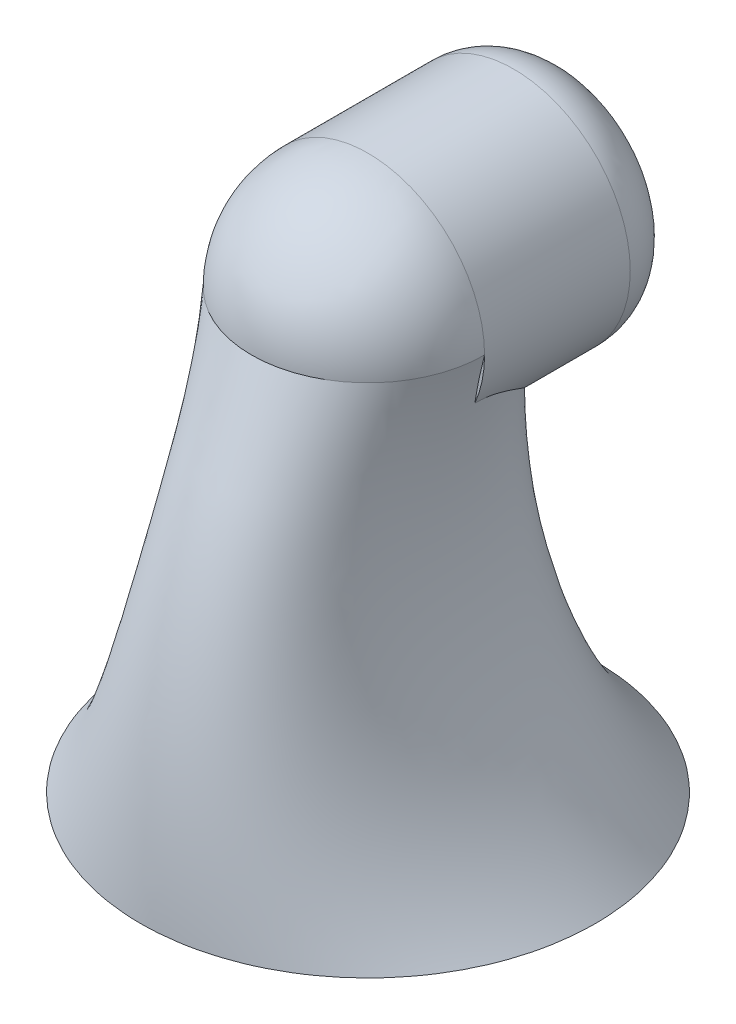
ISO-10303-21;
HEADER;
FILE_DESCRIPTION(('STEP AP214'),'2;1');
FILE_NAME('part.step','',(''),(''),'','','');
FILE_SCHEMA(('AUTOMOTIVE_DESIGN { 1 0 10303 214 1 1 1 1 }'));
ENDSEC;
DATA;
#1=APPLICATION_CONTEXT('core data for automotive mechanical design processes');
#2=APPLICATION_PROTOCOL_DEFINITION('international standard','automotive_design',2000,#1);
#3=PRODUCT_CONTEXT('',#1,'mechanical');
#4=PRODUCT('Part','Part','',(#3));
#5=PRODUCT_RELATED_PRODUCT_CATEGORY('part','',(#4));
#6=PRODUCT_DEFINITION_FORMATION('','',#4);
#7=PRODUCT_DEFINITION_CONTEXT('part definition',#1,'design');
#8=PRODUCT_DEFINITION('design','',#6,#7);
#9=PRODUCT_DEFINITION_SHAPE('','',#8);
#10=(LENGTH_UNIT() NAMED_UNIT(*) SI_UNIT(.MILLI.,.METRE.));
#11=(NAMED_UNIT(*) PLANE_ANGLE_UNIT() SI_UNIT($,.RADIAN.));
#12=(NAMED_UNIT(*) SI_UNIT($,.STERADIAN.) SOLID_ANGLE_UNIT());
#13=UNCERTAINTY_MEASURE_WITH_UNIT(LENGTH_MEASURE(1.E-05),#10,'distance_accuracy_value','');
#14=(GEOMETRIC_REPRESENTATION_CONTEXT(3) GLOBAL_UNCERTAINTY_ASSIGNED_CONTEXT((#13)) GLOBAL_UNIT_ASSIGNED_CONTEXT((#10,
#11,#12)) REPRESENTATION_CONTEXT('',''));
#15=CARTESIAN_POINT('',(0.,0.,0.));
#16=DIRECTION('',(0.,0.,1.));
#17=DIRECTION('',(1.,0.,0.));
#18=AXIS2_PLACEMENT_3D('',#15,#16,#17);
#19=CARTESIAN_POINT('',(0.,0.,0.));
#20=DIRECTION('',(0.,1.,0.));
#21=DIRECTION('',(0.,0.,1.));
#22=AXIS2_PLACEMENT_3D('',#19,#20,#21);
#23=PLANE('',#22);
#24=CARTESIAN_POINT('',(0.,0.,0.));
#25=DIRECTION('',(0.,1.,0.));
#26=DIRECTION('',(0.,0.,1.));
#27=AXIS2_PLACEMENT_3D('',#24,#25,#26);
#28=CIRCLE('',#27,49.53);
#29=CARTESIAN_POINT('',(0.,0.,49.53));
#30=VERTEX_POINT('',#29);
#31=EDGE_CURVE('E172',#30,#30,#28,.T.);
#32=ORIENTED_EDGE('',*,*,#31,.F.);
#33=EDGE_LOOP('',(#32));
#34=FACE_BOUND('',#33,.T.);
#35=ADVANCED_FACE('F125',(#34),#23,.F.);
#36=CARTESIAN_POINT('',(0.,0.,49.53));
#37=CARTESIAN_POINT('',(0.,25.7711736858636,49.1095552228812));
#38=CARTESIAN_POINT('',(0.,51.2272583817081,43.7899315498607));
#39=CARTESIAN_POINT('',(0.,81.7567677831867,31.0366234298882));
#40=CARTESIAN_POINT('',(0.,88.5033838915933,28.2183117149441));
#41=CARTESIAN_POINT('',(0.,95.25,25.4));
#42=CARTESIAN_POINT('',(3.24173089833027,0.,49.53));
#43=CARTESIAN_POINT('',(2.83163109443923,25.7711736858636,49.1095552228812));
#44=CARTESIAN_POINT('',(2.4215312905482,51.2272583817081,43.7899315498607));
#45=CARTESIAN_POINT('',(1.89509635834071,81.7567677831867,31.0366234298882));
#46=CARTESIAN_POINT('',(1.77876123002427,88.5033838915933,28.2183117149441));
#47=CARTESIAN_POINT('',(1.66242610170783,95.25,25.4));
#48=CARTESIAN_POINT('',(9.72511526859896,0.,48.8916256279805));
#49=CARTESIAN_POINT('',(8.10930576723875,25.5863081965169,48.3692701273381));
#50=CARTESIAN_POINT('',(6.7735031530763,51.0663292951272,43.100835071291));
#51=CARTESIAN_POINT('',(5.47915625765749,81.7084797085026,30.5983814868677));
#52=CARTESIAN_POINT('',(5.21947636275439,88.4809154366026,27.8355052926241));
#53=CARTESIAN_POINT('',(4.98723396257223,95.25,25.0726290983805));
#54=CARTESIAN_POINT('',(19.0765359053431,0.,46.0547848691295));
#55=CARTESIAN_POINT('',(14.832016895656,24.893062611467,45.2062982326445));
#56=CARTESIAN_POINT('',(11.9175306001582,50.4628452204486,40.1858545676182));
#57=CARTESIAN_POINT('',(10.1731282058863,81.5273994284373,28.6960350448522));
#58=CARTESIAN_POINT('',(9.91281794229013,88.3966587303878,26.1569375292129));
#59=CARTESIAN_POINT('',(9.78283577861846,95.25,23.6178400135736));
#60=CARTESIAN_POINT('',(27.6948344153667,0.,41.4482700122693));
#61=CARTESIAN_POINT('',(20.3360723762101,23.9225187923972,40.2235230694188));
#62=CARTESIAN_POINT('',(15.7773792090311,49.6179675158985,35.6305906356358));
#63=CARTESIAN_POINT('',(14.1293954365525,81.2738870363459,25.6615678035547));
#64=CARTESIAN_POINT('',(14.0287486947857,88.2786993416869,23.4585461585119));
#65=CARTESIAN_POINT('',(14.2024769002282,95.2499999999999,21.2555245134691));
#66=CARTESIAN_POINT('',(35.2488278174693,0.,35.2488278174694));
#67=CARTESIAN_POINT('',(24.6213256202182,22.8133258563174,33.7123338673236));
#68=CARTESIAN_POINT('',(18.4739336181314,48.6523929964128,29.7262504692269));
#69=CARTESIAN_POINT('',(17.3089150618604,80.9841585882415,21.6470945475282));
#70=CARTESIAN_POINT('',(17.4731186893286,88.1438886117433,19.86170838993));
#71=CARTESIAN_POINT('',(18.0763222323318,95.25,18.0763222323318));
#72=CARTESIAN_POINT('',(41.4482700122693,0.,27.6948344153668));
#73=CARTESIAN_POINT('',(27.723386729649,21.7041329202375,26.0179525306509));
#74=CARTESIAN_POINT('',(20.1586549653796,47.686818476927,22.8100772409658));
#75=CARTESIAN_POINT('',(19.6965710107616,80.6944301401369,16.8407576150949));
#76=CARTESIAN_POINT('',(20.174235320185,88.0090778817993,15.5216172576616));
#77=CARTESIAN_POINT('',(21.2555245134691,95.2499999999998,14.2024769002283));
#78=CARTESIAN_POINT('',(46.0547848691295,0.,19.0765359053432));
#79=CARTESIAN_POINT('',(29.7231748117933,20.7335891011678,17.5309099690154));
#80=CARTESIAN_POINT('',(21.0217524305963,46.8419407723771,15.2580621653272));
#81=CARTESIAN_POINT('',(21.3075731083244,80.4409177480458,11.4610252406939));
#82=CARTESIAN_POINT('',(22.0888706953761,87.8911184930989,10.6219305096561));
#83=CARTESIAN_POINT('',(23.6178400135735,95.2500000000002,9.78283577861844));
#84=CARTESIAN_POINT('',(48.8916256279804,0.,9.72511526859901));
#85=CARTESIAN_POINT('',(30.7554416485716,20.0403435161178,8.67749378268287));
#86=CARTESIAN_POINT('',(21.2994711722935,46.2384566976984,7.47677295626979));
#87=CARTESIAN_POINT('',(22.1931587333865,80.2598374679802,5.75029247551172));
#88=CARTESIAN_POINT('',(23.2076127477089,87.8068617868837,5.36876321904197));
#89=CARTESIAN_POINT('',(25.0726290983806,95.2499999999998,4.98723396257223));
#90=CARTESIAN_POINT('',(49.53,0.,3.24173089833028));
#91=CARTESIAN_POINT('',(30.9275387286706,19.8554780267712,2.83163109443923));
#92=CARTESIAN_POINT('',(21.2852978476698,46.0775276111175,2.42153129054819));
#93=CARTESIAN_POINT('',(22.3602644585528,80.2115493932963,1.89509635834071));
#94=CARTESIAN_POINT('',(23.4411323137413,87.7843933318932,1.77876123002427));
#95=CARTESIAN_POINT('',(25.4,95.25,1.66242610170783));
#96=CARTESIAN_POINT('',(49.53,0.,-3.24173089833027));
#97=CARTESIAN_POINT('',(30.9275387286706,19.8554780267712,-2.83163109443923));
#98=CARTESIAN_POINT('',(21.2852978476698,46.0775276111175,-2.4215312905482));
#99=CARTESIAN_POINT('',(22.3602644585528,80.2115493932963,-1.89509635834071));
#100=CARTESIAN_POINT('',(23.4411323137413,87.7843933318932,-1.77876123002427));
#101=CARTESIAN_POINT('',(25.4,95.25,-1.66242610170783));
#102=CARTESIAN_POINT('',(48.8916256279805,0.,-9.72511526859894));
#103=CARTESIAN_POINT('',(30.7554416485716,19.8245459817762,-8.05517666480631));
#104=CARTESIAN_POINT('',(21.2994711722936,46.0649702448047,-6.70102564128846));
#105=CARTESIAN_POINT('',(22.1931587333865,80.2102422126917,-5.44821592535659));
#106=CARTESIAN_POINT('',(23.2076127477089,87.7847989097941,-5.201795622388));
#107=CARTESIAN_POINT('',(25.0726290983805,95.25,-4.98723396257223));
#108=CARTESIAN_POINT('',(46.0547848691294,0.,-19.0765359053431));
#109=CARTESIAN_POINT('',(29.7231748117933,19.7085508130449,-14.574903659102));
#110=CARTESIAN_POINT('',(21.0217524305963,46.0178801211318,-11.573262419166));
#111=CARTESIAN_POINT('',(21.3075731083244,80.2053402854244,-10.026161627457));
#112=CARTESIAN_POINT('',(22.0888706953761,87.7863198269227,-9.82883442554977));
#113=CARTESIAN_POINT('',(23.6178400135736,95.2500000000001,-9.78283577861846));
#114=CARTESIAN_POINT('',(41.4482700122694,0.,-27.6948344153668));
#115=CARTESIAN_POINT('',(27.723386729649,19.5461575768209,-19.7947813518859));
#116=CARTESIAN_POINT('',(20.1586549653796,45.9519539479896,-15.0526040911528));
#117=CARTESIAN_POINT('',(19.6965710107616,80.1984775872499,-13.8199921135436));
#118=CARTESIAN_POINT('',(20.1742353201849,87.7884491109022,-13.8519412911218));
#119=CARTESIAN_POINT('',(21.2555245134691,95.2499999999998,-14.2024769002283));
#120=CARTESIAN_POINT('',(35.2488278174693,0.,-35.2488278174692));
#121=CARTESIAN_POINT('',(24.6213256202183,19.3605653068509,-23.7552599812994));
#122=CARTESIAN_POINT('',(18.4739336181315,45.8766097501131,-17.3142934295261));
#123=CARTESIAN_POINT('',(17.3089150618605,80.1906345036224,-16.8138697450461));
#124=CARTESIAN_POINT('',(17.4731186893286,87.7908825783081,-17.1902268434663));
#125=CARTESIAN_POINT('',(18.0763222323318,95.2500000000002,-18.0763222323318));
#126=CARTESIAN_POINT('',(27.6948344153668,0.,-41.4482700122695));
#127=CARTESIAN_POINT('',(20.3360723762101,19.1749730368806,-26.5325464761358));
#128=CARTESIAN_POINT('',(15.7773792090311,45.8012655522361,-18.5641497060474));
#129=CARTESIAN_POINT('',(14.1293954365525,80.1827914199943,-19.015883700142));
#130=CARTESIAN_POINT('',(14.0287486947857,87.7933160457132,-19.7852590321244));
#131=CARTESIAN_POINT('',(14.2024769002282,95.2499999999997,-21.2555245134691));
#132=CARTESIAN_POINT('',(19.0765359053432,0.,-46.0547848691294));
#133=CARTESIAN_POINT('',(14.832016895656,19.0125798006569,-28.2481567705097));
#134=CARTESIAN_POINT('',(11.9175306001583,45.7353393790943,-19.0467402343778));
#135=CARTESIAN_POINT('',(10.1731282058863,80.1759287218204,-20.464449053125));
#136=CARTESIAN_POINT('',(9.91281794229012,87.7954453296935,-21.607070520392));
#137=CARTESIAN_POINT('',(9.78283577861845,95.2500000000002,-23.6178400135735));
#138=CARTESIAN_POINT('',(9.72511526859895,0.,-48.8916256279805));
#139=CARTESIAN_POINT('',(8.10930576723873,18.8965846319254,-29.0774394731665));
#140=CARTESIAN_POINT('',(6.77350315307629,45.6882492554211,-19.0526683068707));
#141=CARTESIAN_POINT('',(5.47915625765748,80.1710267945527,-21.2340084320588));
#142=CARTESIAN_POINT('',(5.21947636275438,87.7969662468216,-22.6595097963508));
#143=CARTESIAN_POINT('',(4.98723396257222,95.2499999999998,-25.0726290983805));
#144=CARTESIAN_POINT('',(3.24173089833028,0.,-49.53));
#145=CARTESIAN_POINT('',(2.83163109443923,18.8656525869305,-29.1954074508331));
#146=CARTESIAN_POINT('',(2.42153129054819,45.6756918891084,-18.9660174704591));
#147=CARTESIAN_POINT('',(1.89509635834071,80.1697196139483,-21.3701738249242));
#148=CARTESIAN_POINT('',(1.77876123002427,87.7973718247227,-22.8753486220169));
#149=CARTESIAN_POINT('',(1.66242610170783,95.25,-25.4));
#150=CARTESIAN_POINT('',(-3.24173089833027,0.,-49.53));
#151=CARTESIAN_POINT('',(-2.83163109443923,18.8656525869305,-29.1954074508331));
#152=CARTESIAN_POINT('',(-2.4215312905482,45.6756918891084,-18.9660174704591));
#153=CARTESIAN_POINT('',(-1.89509635834071,80.1697196139483,-21.3701738249242));
#154=CARTESIAN_POINT('',(-1.77876123002427,87.7973718247227,-22.8753486220169));
#155=CARTESIAN_POINT('',(-1.66242610170783,95.25,-25.4));
#156=CARTESIAN_POINT('',(-9.72511526859892,0.,-48.8916256279806));
#157=CARTESIAN_POINT('',(-8.10930576723872,18.8965846319255,-29.0774394731666));
#158=CARTESIAN_POINT('',(-6.77350315307629,45.6882492554213,-19.0526683068708));
#159=CARTESIAN_POINT('',(-5.47915625765748,80.1710267945529,-21.2340084320588));
#160=CARTESIAN_POINT('',(-5.21947636275438,87.7969662468218,-22.6595097963508));
#161=CARTESIAN_POINT('',(-4.98723396257223,95.2500000000001,-25.0726290983805));
#162=CARTESIAN_POINT('',(-19.0765359053431,0.,-46.0547848691294));
#163=CARTESIAN_POINT('',(-14.832016895656,19.0125798006568,-28.2481567705097));
#164=CARTESIAN_POINT('',(-11.9175306001582,45.7353393790941,-19.0467402343778));
#165=CARTESIAN_POINT('',(-10.1731282058863,80.1759287218201,-20.4644490531251));
#166=CARTESIAN_POINT('',(-9.91281794229012,87.7954453296932,-21.6070705203921));
#167=CARTESIAN_POINT('',(-9.78283577861846,95.2499999999999,-23.6178400135736));
#168=CARTESIAN_POINT('',(-27.6948344153667,0.,-41.4482700122695));
#169=CARTESIAN_POINT('',(-20.3360723762101,19.1749730368807,-26.5325464761358));
#170=CARTESIAN_POINT('',(-15.7773792090311,45.8012655522363,-18.5641497060473));
#171=CARTESIAN_POINT('',(-14.1293954365525,80.1827914199945,-19.0158837001419));
#172=CARTESIAN_POINT('',(-14.0287486947857,87.7933160457135,-19.7852590321244));
#173=CARTESIAN_POINT('',(-14.2024769002282,95.25,-21.2555245134691));
#174=CARTESIAN_POINT('',(-35.2488278174693,0.,-35.2488278174693));
#175=CARTESIAN_POINT('',(-24.6213256202182,19.3605653068508,-23.7552599812995));
#176=CARTESIAN_POINT('',(-18.4739336181314,45.876609750113,-17.3142934295261));
#177=CARTESIAN_POINT('',(-17.3089150618604,80.1906345036223,-16.8138697450462));
#178=CARTESIAN_POINT('',(-17.4731186893286,87.790882578308,-17.1902268434664));
#179=CARTESIAN_POINT('',(-18.0763222323318,95.2500000000001,-18.0763222323318));
#180=CARTESIAN_POINT('',(-41.4482700122694,0.,-27.6948344153668));
#181=CARTESIAN_POINT('',(-27.7233867296491,19.5461575768209,-19.7947813518859));
#182=CARTESIAN_POINT('',(-20.1586549653797,45.9519539479896,-15.0526040911528));
#183=CARTESIAN_POINT('',(-19.6965710107616,80.1984775872499,-13.8199921135436));
#184=CARTESIAN_POINT('',(-20.174235320185,87.7884491109023,-13.8519412911218));
#185=CARTESIAN_POINT('',(-21.2555245134691,95.2499999999999,-14.2024769002282));
#186=CARTESIAN_POINT('',(-46.0547848691294,0.,-19.0765359053432));
#187=CARTESIAN_POINT('',(-29.7231748117933,19.7085508130448,-14.574903659102));
#188=CARTESIAN_POINT('',(-21.0217524305963,46.0178801211319,-11.573262419166));
#189=CARTESIAN_POINT('',(-21.3075731083243,80.2053402854243,-10.026161627457));
#190=CARTESIAN_POINT('',(-22.0888706953761,87.7863198269227,-9.82883442554975));
#191=CARTESIAN_POINT('',(-23.6178400135735,95.2500000000001,-9.78283577861844));
#192=CARTESIAN_POINT('',(-48.8916256279805,0.,-9.725115268599));
#193=CARTESIAN_POINT('',(-30.7554416485716,19.8245459817761,-8.05517666480635));
#194=CARTESIAN_POINT('',(-21.2994711722936,46.0649702448047,-6.70102564128848));
#195=CARTESIAN_POINT('',(-22.1931587333865,80.2102422126915,-5.4482159253566));
#196=CARTESIAN_POINT('',(-23.2076127477089,87.7847989097939,-5.201795622388));
#197=CARTESIAN_POINT('',(-25.0726290983806,95.2499999999998,-4.98723396257223));
#198=CARTESIAN_POINT('',(-49.53,0.,-3.24173089833028));
#199=CARTESIAN_POINT('',(-30.9275387286706,19.8554780267711,-2.83163109443923));
#200=CARTESIAN_POINT('',(-21.2852978476698,46.0775276111176,-2.4215312905482));
#201=CARTESIAN_POINT('',(-22.3602644585528,80.2115493932962,-1.89509635834071));
#202=CARTESIAN_POINT('',(-23.4411323137413,87.7843933318932,-1.77876123002427));
#203=CARTESIAN_POINT('',(-25.4,95.25,-1.66242610170784));
#204=CARTESIAN_POINT('',(-49.53,0.,3.24173089833026));
#205=CARTESIAN_POINT('',(-30.9275387286706,19.8554780267711,2.83163109443923));
#206=CARTESIAN_POINT('',(-21.2852978476698,46.0775276111176,2.4215312905482));
#207=CARTESIAN_POINT('',(-22.3602644585528,80.2115493932962,1.89509635834071));
#208=CARTESIAN_POINT('',(-23.4411323137413,87.7843933318932,1.77876123002427));
#209=CARTESIAN_POINT('',(-25.4,95.25,1.66242610170783));
#210=CARTESIAN_POINT('',(-48.8916256279805,0.,9.72511526859894));
#211=CARTESIAN_POINT('',(-30.7554416485717,20.0403435161178,8.67749378268282));
#212=CARTESIAN_POINT('',(-21.2994711722936,46.2384566976985,7.47677295626976));
#213=CARTESIAN_POINT('',(-22.1931587333864,80.2598374679802,5.75029247551172));
#214=CARTESIAN_POINT('',(-23.2076127477089,87.8068617868838,5.36876321904198));
#215=CARTESIAN_POINT('',(-25.0726290983805,95.2499999999999,4.98723396257223));
#216=CARTESIAN_POINT('',(-46.0547848691294,0.,19.0765359053431));
#217=CARTESIAN_POINT('',(-29.7231748117933,20.7335891011677,17.5309099690153));
#218=CARTESIAN_POINT('',(-21.0217524305963,46.8419407723771,15.2580621653272));
#219=CARTESIAN_POINT('',(-21.3075731083244,80.4409177480456,11.4610252406939));
#220=CARTESIAN_POINT('',(-22.0888706953762,87.8911184930987,10.6219305096562));
#221=CARTESIAN_POINT('',(-23.6178400135736,95.25,9.78283577861845));
#222=CARTESIAN_POINT('',(-41.4482700122694,0.,27.6948344153668));
#223=CARTESIAN_POINT('',(-27.7233867296491,21.7041329202375,26.0179525306509));
#224=CARTESIAN_POINT('',(-20.1586549653797,47.686818476927,22.8100772409658));
#225=CARTESIAN_POINT('',(-19.6965710107615,80.6944301401368,16.8407576150949));
#226=CARTESIAN_POINT('',(-20.1742353201849,88.0090778817993,15.5216172576616));
#227=CARTESIAN_POINT('',(-21.255524513469,95.2499999999998,14.2024769002283));
#228=CARTESIAN_POINT('',(-35.2488278174693,0.,35.2488278174693));
#229=CARTESIAN_POINT('',(-24.6213256202183,22.8133258563174,33.7123338673235));
#230=CARTESIAN_POINT('',(-18.4739336181315,48.652392996413,29.7262504692269));
#231=CARTESIAN_POINT('',(-17.3089150618605,80.9841585882417,21.6470945475281));
#232=CARTESIAN_POINT('',(-17.4731186893286,88.1438886117435,19.8617083899299));
#233=CARTESIAN_POINT('',(-18.0763222323318,95.2500000000003,18.0763222323317));
#234=CARTESIAN_POINT('',(-27.6948344153667,0.,41.4482700122694));
#235=CARTESIAN_POINT('',(-20.3360723762101,23.9225187923971,40.2235230694189));
#236=CARTESIAN_POINT('',(-15.7773792090311,49.6179675158984,35.6305906356359));
#237=CARTESIAN_POINT('',(-14.1293954365525,81.2738870363456,25.6615678035548));
#238=CARTESIAN_POINT('',(-14.0287486947856,88.2786993416867,23.4585461585119));
#239=CARTESIAN_POINT('',(-14.2024769002282,95.2499999999997,21.2555245134692));
#240=CARTESIAN_POINT('',(-19.0765359053432,0.,46.0547848691294));
#241=CARTESIAN_POINT('',(-14.832016895656,24.8930626114671,45.2062982326444));
#242=CARTESIAN_POINT('',(-11.9175306001582,50.4628452204487,40.1858545676182));
#243=CARTESIAN_POINT('',(-10.1731282058863,81.5273994284375,28.6960350448521));
#244=CARTESIAN_POINT('',(-9.91281794229011,88.396658730388,26.1569375292128));
#245=CARTESIAN_POINT('',(-9.78283577861844,95.2500000000002,23.6178400135735));
#246=CARTESIAN_POINT('',(-9.72511526859897,0.,48.8916256279805));
#247=CARTESIAN_POINT('',(-8.10930576723875,25.5863081965169,48.3692701273381));
#248=CARTESIAN_POINT('',(-6.77350315307631,51.0663292951271,43.100835071291));
#249=CARTESIAN_POINT('',(-5.47915625765748,81.7084797085024,30.5983814868677));
#250=CARTESIAN_POINT('',(-5.21947636275438,88.4809154366024,27.8355052926241));
#251=CARTESIAN_POINT('',(-4.98723396257222,95.2499999999998,25.0726290983806));
#252=CARTESIAN_POINT('',(-3.24173089833027,0.,49.53));
#253=CARTESIAN_POINT('',(-2.83163109443923,25.7711736858636,49.1095552228812));
#254=CARTESIAN_POINT('',(-2.4215312905482,51.2272583817081,43.7899315498607));
#255=CARTESIAN_POINT('',(-1.89509635834071,81.7567677831867,31.0366234298882));
#256=CARTESIAN_POINT('',(-1.77876123002427,88.5033838915933,28.2183117149441));
#257=CARTESIAN_POINT('',(-1.66242610170783,95.25,25.4));
#258=CARTESIAN_POINT('',(0.,0.,49.53));
#259=CARTESIAN_POINT('',(0.,25.7711736858636,49.1095552228812));
#260=CARTESIAN_POINT('',(0.,51.2272583817081,43.7899315498607));
#261=CARTESIAN_POINT('',(0.,81.7567677831867,31.0366234298882));
#262=CARTESIAN_POINT('',(0.,88.5033838915933,28.2183117149441));
#263=CARTESIAN_POINT('',(0.,95.25,25.4));
#264=B_SPLINE_SURFACE_WITH_KNOTS('',3,3,((#36,#37,#38,#39,#40,#41),(#42,#43,#44,#45,#46,#47),
(#48,#49,#50,#51,#52,#53),(#54,#55,#56,#57,#58,#59),(#60,#61,#62,#63,#64,#65),(#66,#67,#68,#69,
#70,#71),(#72,#73,#74,#75,#76,#77),(#78,#79,#80,#81,#82,#83),(#84,#85,#86,#87,#88,#89),(#90,#91,
#92,#93,#94,#95),(#96,#97,#98,#99,#100,#101),(#102,#103,#104,#105,#106,#107),(#108,#109,#110,
#111,#112,#113),(#114,#115,#116,#117,#118,#119),(#120,#121,#122,#123,#124,#125),(#126,#127,#128,
#129,#130,#131),(#132,#133,#134,#135,#136,#137),(#138,#139,#140,#141,#142,#143),(#144,#145,#146,
#147,#148,#149),(#150,#151,#152,#153,#154,#155),(#156,#157,#158,#159,#160,#161),(#162,#163,#164,
#165,#166,#167),(#168,#169,#170,#171,#172,#173),(#174,#175,#176,#177,#178,#179),(#180,#181,#182,
#183,#184,#185),(#186,#187,#188,#189,#190,#191),(#192,#193,#194,#195,#196,#197),(#198,#199,#200,
#201,#202,#203),(#204,#205,#206,#207,#208,#209),(#210,#211,#212,#213,#214,#215),(#216,#217,#218,
#219,#220,#221),(#222,#223,#224,#225,#226,#227),(#228,#229,#230,#231,#232,#233),(#234,#235,#236,
#237,#238,#239),(#240,#241,#242,#243,#244,#245),(#246,#247,#248,#249,#250,#251),(#252,#253,#254,
#255,#256,#257),(#258,#259,#260,#261,#262,#263)),.UNSPECIFIED.,.T.,.F.,.F.,(4,1,1,1,1,1,1,1,2,1,
1,1,1,1,1,1,2,1,1,1,1,1,1,1,2,1,1,1,1,1,1,1,4),(4,2,4),(0.,0.03125,0.0625,0.09375,0.125,0.15625,
0.1875,0.21875,0.25,0.28125,0.3125,0.34375,0.375,0.40625,0.4375,0.46875,0.5,0.53125,0.5625,
0.59375,0.625,0.65625,0.6875,0.71875,0.75,0.78125,0.8125,0.84375,0.875,0.90625,0.9375,0.96875,
1.),(0.,0.779013281226195,1.),.UNSPECIFIED.);
#265=CARTESIAN_POINT('',(25.4,95.25,1.80314331677719E-13));
#266=CARTESIAN_POINT('',(24.9962612195073,93.7114471828637,0.));
#267=CARTESIAN_POINT('',(24.6286086010547,92.1634152359506,0.));
#268=CARTESIAN_POINT('',(23.9662291649976,89.0515560351294,0.));
#269=CARTESIAN_POINT('',(23.6715146064627,87.4877261718954,0.));
#270=CARTESIAN_POINT('',(23.1574370392253,84.357307148356,0.));
#271=CARTESIAN_POINT('',(22.9376355230186,82.7907899477554,0.));
#272=CARTESIAN_POINT('',(22.5715214692547,79.6494362739533,0.));
#273=CARTESIAN_POINT('',(22.4251960191456,78.0746013116921,0.));
#274=CARTESIAN_POINT('',(22.2355803790432,75.3416820918577,0.));
#275=CARTESIAN_POINT('',(22.1752017822635,74.1847543313191,0.));
#276=CARTESIAN_POINT('',(22.0939976076464,71.8669690663365,0.));
#277=CARTESIAN_POINT('',(22.073259129067,70.7061085099078,0.));
#278=CARTESIAN_POINT('',(22.0724514299119,69.5452,0.));
#279=B_SPLINE_CURVE_WITH_KNOTS('',3,(#265,#266,#267,#268,#269,#270,#271,#272,#273,#274,#275,
#276,#277,#278),.UNSPECIFIED.,.F.,.F.,(4,2,2,2,2,2,4),(0.,4.77151446407106,9.54383035695857,
14.2877111523736,19.0307579746746,22.5056189954451,25.9881064177258),.UNSPECIFIED.);
#280=CARTESIAN_POINT('',(25.4000000007437,95.25,-6.88255088668085E-05));
#281=VERTEX_POINT('',#280);
#282=CARTESIAN_POINT('',(23.2822602558102,85.0963623572278,0.));
#283=VERTEX_POINT('',#282);
#284=EDGE_CURVE('E168',#281,#283,#279,.T.);
#285=CARTESIAN_POINT('',(0.,95.25,0.));
#286=DIRECTION('',(0.,1.,0.));
#287=DIRECTION('',(0.,0.,1.));
#288=AXIS2_PLACEMENT_3D('',#285,#286,#287);
#289=CIRCLE('',#288,25.4);
#290=CARTESIAN_POINT('',(-25.4,95.25,0.));
#291=VERTEX_POINT('',#290);
#292=EDGE_CURVE('E163',#291,#281,#289,.T.);
#293=CARTESIAN_POINT('',(-22.0724514299119,69.5452,0.));
#294=CARTESIAN_POINT('',(-22.0735323853002,71.1359832689939,0.));
#295=CARTESIAN_POINT('',(-22.1120800325495,72.7267440410701,0.));
#296=CARTESIAN_POINT('',(-22.2639027475444,75.9047513825053,0.));
#297=CARTESIAN_POINT('',(-22.3771804155979,77.4919978276515,0.));
#298=CARTESIAN_POINT('',(-22.6773615878649,80.6499750531929,0.));
#299=CARTESIAN_POINT('',(-22.8638231007828,82.2207479122335,0.));
#300=CARTESIAN_POINT('',(-23.3099293517043,85.3518176154898,0.));
#301=CARTESIAN_POINT('',(-23.5695703225355,86.9121149947359,0.));
#302=CARTESIAN_POINT('',(-24.0824637630702,89.604588988602,0.));
#303=CARTESIAN_POINT('',(-24.3189599480022,90.7399872826803,0.));
#304=CARTESIAN_POINT('',(-24.8305870635991,93.0019212940817,0.));
#305=CARTESIAN_POINT('',(-25.1057139597767,94.1284579239354,0.));
#306=CARTESIAN_POINT('',(-25.4,95.25,0.));
#307=B_SPLINE_CURVE_WITH_KNOTS('',3,(#293,#294,#295,#296,#297,#298,#299,#300,#301,#302,#303,
#304,#305,#306),.UNSPECIFIED.,.F.,.F.,(4,2,2,2,2,2,4),(0.,4.77191899246627,9.54400403750675,
14.2877010795751,19.0311539675825,22.5098108078598,25.988104616446),.UNSPECIFIED.);
#308=CARTESIAN_POINT('',(-23.2822602558069,85.096362357207,0.));
#309=VERTEX_POINT('',#308);
#310=EDGE_CURVE('E145',#309,#291,#307,.T.);
#311=CARTESIAN_POINT('',(23.2822602558102,85.0963623572278,0.));
#312=CARTESIAN_POINT('',(23.2822611417427,85.0963652594225,-0.102206111149585));
#313=CARTESIAN_POINT('',(23.2817277761832,85.0951412764448,-0.204408330755876));
#314=CARTESIAN_POINT('',(23.2795768248814,85.0902109576997,-0.408741653135299));
#315=CARTESIAN_POINT('',(23.2779592354961,85.0865046135914,-0.510872755668317));
#316=CARTESIAN_POINT('',(23.2714727582796,85.0716562555403,-0.816300673933502));
#317=CARTESIAN_POINT('',(23.2649703721702,85.0567852945667,-1.01939679814615));
#318=CARTESIAN_POINT('',(23.2476047461426,85.0172421242778,-1.42401737856873));
#319=CARTESIAN_POINT('',(23.2367502981155,84.9925896762367,-1.62554417335515));
#320=CARTESIAN_POINT('',(23.2107842094297,84.9339677782439,-2.0268382074753));
#321=CARTESIAN_POINT('',(23.1956749886882,84.9000036246474,-2.2266063806204));
#322=CARTESIAN_POINT('',(23.1615750028136,84.8239194202552,-2.62170494501411));
#323=CARTESIAN_POINT('',(23.1426335631731,84.7819033385335,-2.81705977143323));
#324=CARTESIAN_POINT('',(23.1009462480473,84.6902264354654,-3.2056942014008));
#325=CARTESIAN_POINT('',(23.0781976745697,84.6405601947011,-3.39897222908164));
#326=CARTESIAN_POINT('',(23.0290981277208,84.5344011465416,-3.78331444533857));
#327=CARTESIAN_POINT('',(23.0027447334446,84.4779037545062,-3.97437705175366));
#328=CARTESIAN_POINT('',(22.9466393646737,84.3588993206341,-4.35414571727099));
#329=CARTESIAN_POINT('',(22.9168867235172,84.2963911003329,-4.54285130603597));
#330=CARTESIAN_POINT('',(22.8330626943987,84.1222939729131,-5.04397790599506));
#331=CARTESIAN_POINT('',(22.7760905076227,84.0059630005887,-5.35427298250956));
#332=CARTESIAN_POINT('',(22.6537716838776,83.7615135745322,-5.96846222425132));
#333=CARTESIAN_POINT('',(22.5884245629996,83.6333944397933,-6.27235601842613));
#334=CARTESIAN_POINT('',(22.4497488683162,83.3676069861584,-6.87422623454983));
#335=CARTESIAN_POINT('',(22.3764169585061,83.2299346847779,-7.17220012123859));
#336=CARTESIAN_POINT('',(22.2219464170202,82.946702385139,-7.76236699767706));
#337=CARTESIAN_POINT('',(22.1408064990811,82.801141089007,-8.05455902535263));
#338=CARTESIAN_POINT('',(21.9698714986944,82.5018731882666,-8.63597928098445));
#339=CARTESIAN_POINT('',(21.8800003499733,82.3481014612948,-8.92515157732401));
#340=CARTESIAN_POINT('',(21.6920953281422,82.0346154063441,-9.49738554959534));
#341=CARTESIAN_POINT('',(21.5940649897744,81.8749036681271,-9.78044980542604));
#342=CARTESIAN_POINT('',(21.3894838035277,81.5501164955678,-10.3402528087433));
#343=CARTESIAN_POINT('',(21.2829350999812,81.385042417263,-10.6169931257444));
#344=CARTESIAN_POINT('',(21.0608971538569,81.0500351695443,-11.1638612018345));
#345=CARTESIAN_POINT('',(20.9454080777412,80.8801020906382,-11.4339890839182));
#346=CARTESIAN_POINT('',(20.6877377093169,80.51110061747,-12.0052943852211));
#347=CARTESIAN_POINT('',(20.5441026551666,80.3113457034681,-12.3053764939413));
#348=CARTESIAN_POINT('',(20.2435390980856,79.9065097190962,-12.895140831779));
#349=CARTESIAN_POINT('',(20.0866103770244,79.7014285613684,-13.184822890135));
#350=CARTESIAN_POINT('',(19.7583928767618,79.2864195650349,-13.7524400285914));
#351=CARTESIAN_POINT('',(19.5871023527761,79.0764911397967,-14.0303736752153));
#352=CARTESIAN_POINT('',(19.230321298231,78.6538945151959,-14.5712405783526));
#353=CARTESIAN_POINT('',(19.0449280343238,78.4412522408985,-14.8342580132252));
#354=CARTESIAN_POINT('',(18.6581252198999,78.0128996229466,-15.3456038454963));
#355=CARTESIAN_POINT('',(18.456716873402,77.7971895109324,-15.5939333446953));
#356=CARTESIAN_POINT('',(18.037144114164,77.363906852445,-16.0741886300319));
#357=CARTESIAN_POINT('',(17.8189839077982,77.1463347856198,-16.3061185061835));
#358=CARTESIAN_POINT('',(17.4048212564571,76.7486581042132,-16.7131519668564));
#359=CARTESIAN_POINT('',(17.2115673040695,76.568620599839,-16.8911218948868));
#360=CARTESIAN_POINT('',(16.8131545845471,76.2092598891438,-17.2339843604842));
#361=CARTESIAN_POINT('',(16.6079962618691,76.0299366564219,-17.3988773857419));
#362=CARTESIAN_POINT('',(16.1859089532334,75.6731590760415,-17.7150171203842));
#363=CARTESIAN_POINT('',(15.9689808879871,75.4957045834901,-17.866264894738));
#364=CARTESIAN_POINT('',(15.5234387777475,75.1436945222404,-18.1548833083257));
#365=CARTESIAN_POINT('',(15.2948145619964,74.9691416576697,-18.2922415496247));
#366=CARTESIAN_POINT('',(14.8265088006298,74.6243077803287,-18.5528098032217));
#367=CARTESIAN_POINT('',(14.586826374744,74.4540271093106,-18.6760186864506));
#368=CARTESIAN_POINT('',(14.0970726869447,74.1189656684148,-18.9083862471029));
#369=CARTESIAN_POINT('',(13.8470017063417,73.9541847498275,-19.0175453046523));
#370=CARTESIAN_POINT('',(13.2113343472301,73.5515308386516,-19.2728694609701));
#371=CARTESIAN_POINT('',(12.8197719399945,73.3177284066665,-19.410703996871));
#372=CARTESIAN_POINT('',(12.0179801376625,72.8683226412486,-19.6586073078088));
#373=CARTESIAN_POINT('',(11.6077508097205,72.6527192423523,-19.7686761827239));
#374=CARTESIAN_POINT('',(10.7709400833744,72.2420815564458,-19.9642732750967));
#375=CARTESIAN_POINT('',(10.3443417405099,72.0470694130149,-20.0497752402383));
#376=CARTESIAN_POINT('',(9.47779064803354,71.6798286203514,-20.1996159559507));
#377=CARTESIAN_POINT('',(9.03783592301984,71.5076033616691,-20.2639515592075));
#378=CARTESIAN_POINT('',(8.28345786296069,71.2364157464873,-20.3580899872336));
#379=CARTESIAN_POINT('',(7.9718309345738,71.1311644259405,-20.3924352615397));
#380=CARTESIAN_POINT('',(7.3440670617604,70.9326583036217,-20.4538059299863));
#381=CARTESIAN_POINT('',(7.02792979438467,70.8394043657239,-20.4808307971742));
#382=CARTESIAN_POINT('',(6.07360321515982,70.5780301771747,-20.5524807698218));
#383=CARTESIAN_POINT('',(5.42951089828963,70.4283017881234,-20.5876798632234));
#384=CARTESIAN_POINT('',(4.45553636173691,70.241643930896,-20.6271677028677));
#385=CARTESIAN_POINT('',(4.12936615894205,70.1857240671839,-20.6381145172035));
#386=CARTESIAN_POINT('',(3.47495406603541,70.0866509251255,-20.6563867185431));
#387=CARTESIAN_POINT('',(3.14671213773807,70.0434978828001,-20.6637120385978));
#388=CARTESIAN_POINT('',(2.4887759022394,69.9700556731519,-20.6754594630297));
#389=CARTESIAN_POINT('',(2.15908169573351,69.9397656277131,-20.679881765598));
#390=CARTESIAN_POINT('',(1.498749102517,69.8920957262581,-20.6864578430841));
#391=CARTESIAN_POINT('',(1.16811076770354,69.8747151738382,-20.6886117403738));
#392=CARTESIAN_POINT('',(0.613949347634652,69.8564378119037,-20.6907644369182));
#393=CARTESIAN_POINT('',(0.39053730737756,69.8520196151182,-20.6912361364211));
#394=CARTESIAN_POINT('',(-0.0563204435744574,69.8490798152022,-20.6915596401449));
#395=CARTESIAN_POINT('',(-0.279766152748288,69.8505579975031,-20.6914114669227));
#396=CARTESIAN_POINT('',(-0.726549491723553,69.8594102164896,-20.6904145838397));
#397=CARTESIAN_POINT('',(-0.949887116671443,69.8667844970787,-20.6895658449985));
#398=CARTESIAN_POINT('',(-1.39628115129423,69.887422628452,-20.6869965868869));
#399=CARTESIAN_POINT('',(-1.61933755836469,69.9006865333858,-20.6852760596011));
#400=CARTESIAN_POINT('',(-2.28788027230829,69.949303347202,-20.6785590857445));
#401=CARTESIAN_POINT('',(-2.73274542392856,69.9934814613006,-20.6720072432241));
#402=CARTESIAN_POINT('',(-3.61921719366119,70.1052033682406,-20.6531755361538));
#403=CARTESIAN_POINT('',(-4.06082500038861,70.1727381585886,-20.6408978779025));
#404=CARTESIAN_POINT('',(-4.93958189644207,70.3309352193623,-20.6087070547327));
#405=CARTESIAN_POINT('',(-5.3767313541325,70.4215955627081,-20.5887945259676));
#406=CARTESIAN_POINT('',(-6.24505077858943,70.6256574958372,-20.5390954218741));
#407=CARTESIAN_POINT('',(-6.67622164305372,70.7390556310814,-20.5093103460275));
#408=CARTESIAN_POINT('',(-7.62359823591485,71.0150278131062,-20.4297537182558));
#409=CARTESIAN_POINT('',(-8.13802387911994,71.1829332001374,-20.3770525719055));
#410=CARTESIAN_POINT('',(-9.15259566901546,71.550190455953,-20.2487269637418));
#411=CARTESIAN_POINT('',(-9.65274322577806,71.749539206684,-20.1731047741888));
#412=CARTESIAN_POINT('',(-10.6344562441897,72.1771901505685,-19.9935938473151));
#413=CARTESIAN_POINT('',(-11.1160479848103,72.4054492753209,-19.8897468985933));
#414=CARTESIAN_POINT('',(-12.0574735748633,72.8880478900887,-19.6486559225429));
#415=CARTESIAN_POINT('',(-12.5173079394534,73.1423867621519,-19.5114126864241));
#416=CARTESIAN_POINT('',(-13.2650536540617,73.5861802743983,-19.2502485712384));
#417=CARTESIAN_POINT('',(-13.5601056646271,73.769727951121,-19.1365922204492));
#418=CARTESIAN_POINT('',(-14.1372088763607,74.1450778235199,-18.8911752855164));
#419=CARTESIAN_POINT('',(-14.4192595298819,74.3368803662531,-18.7594139396778));
#420=CARTESIAN_POINT('',(-14.9691983175911,74.7269211432939,-18.4772958380916));
#421=CARTESIAN_POINT('',(-15.2370881368936,74.9251586073051,-18.326941302044));
#422=CARTESIAN_POINT('',(-15.7575425124761,75.3259548101918,-18.0079118368985));
#423=CARTESIAN_POINT('',(-16.0101293160051,75.5285066677759,-17.8392645484836));
#424=CARTESIAN_POINT('',(-16.4999096913873,75.9364147010337,-17.4839010347448));
#425=CARTESIAN_POINT('',(-16.7371014014807,76.1417712122587,-17.2971826308209));
#426=CARTESIAN_POINT('',(-17.1958286628031,76.5535166839398,-16.9065051853372));
#427=CARTESIAN_POINT('',(-17.4173646130565,76.7599056179386,-16.7025465834762));
#428=CARTESIAN_POINT('',(-17.8612691044272,77.1879600895632,-16.2623468690947));
#429=CARTESIAN_POINT('',(-18.0824074668207,77.4095877348475,-16.0248298476237));
#430=CARTESIAN_POINT('',(-18.5073256218164,77.8507835425133,-15.5329318191492));
#431=CARTESIAN_POINT('',(-18.7111030484336,78.0703514205686,-15.2785485219479));
#432=CARTESIAN_POINT('',(-19.1021139748002,78.5061962439931,-14.754701915544));
#433=CARTESIAN_POINT('',(-19.2893463942423,78.7224729737044,-14.4852376235005));
#434=CARTESIAN_POINT('',(-19.6496716444713,79.1524924725252,-13.9306076945723));
#435=CARTESIAN_POINT('',(-19.8226357050573,79.3661998372727,-13.6453312707597));
#436=CARTESIAN_POINT('',(-20.153749302926,79.7884872484618,-13.0627438624748));
#437=CARTESIAN_POINT('',(-20.3119006125185,79.9970679060932,-12.7654343238471));
#438=CARTESIAN_POINT('',(-20.6144976848335,80.4085817535344,-12.1601974784106));
#439=CARTESIAN_POINT('',(-20.7589447259861,80.6115154688801,-11.85227116567));
#440=CARTESIAN_POINT('',(-21.0294001572113,81.002946045148,-11.2397866165895));
#441=CARTESIAN_POINT('',(-21.1559237684048,81.1916929751188,-10.9356147996889));
#442=CARTESIAN_POINT('',(-21.3979678557633,81.5629234874929,-10.3191423976586));
#443=CARTESIAN_POINT('',(-21.5134873323554,81.745406499945,-10.0068410773508));
#444=CARTESIAN_POINT('',(-21.7341035541758,82.1034043609913,-9.37438719377328));
#445=CARTESIAN_POINT('',(-21.8391939948531,82.2789149566471,-9.05423002558512));
#446=CARTESIAN_POINT('',(-22.0394034592355,82.6220873000527,-8.40618722156078));
#447=CARTESIAN_POINT('',(-22.1345114966099,82.7897402899826,-8.07829354715459));
#448=CARTESIAN_POINT('',(-22.3136368461427,83.1134689684981,-7.41929571137624));
#449=CARTESIAN_POINT('',(-22.3977790317869,83.2696641086864,-7.08828436198958));
#450=CARTESIAN_POINT('',(-22.5561823167149,83.5706368420891,-6.4189142474375));
#451=CARTESIAN_POINT('',(-22.6304472335649,83.7154188376221,-6.08055838009052));
#452=CARTESIAN_POINT('',(-22.768499965453,83.9903802927885,-5.39638070395897));
#453=CARTESIAN_POINT('',(-22.8323020068215,84.1205795028705,-5.05056976845079));
#454=CARTESIAN_POINT('',(-22.9486162227607,84.3624378233725,-4.35093702579716));
#455=CARTESIAN_POINT('',(-23.001140008886,84.4741159749533,-3.99712387634759));
#456=CARTESIAN_POINT('',(-23.0727357856468,84.6286773854352,-3.443985022151));
#457=CARTESIAN_POINT('',(-23.0961646208162,84.6797650761488,-3.24749864755402));
#458=CARTESIAN_POINT('',(-23.1391042386807,84.774097190522,-2.85224161909852));
#459=CARTESIAN_POINT('',(-23.1586156216129,84.8173428156548,-2.6534713201278));
#460=CARTESIAN_POINT('',(-23.1935045471416,84.8951379514427,-2.2539411969763));
#461=CARTESIAN_POINT('',(-23.2088835779046,84.9296905923795,-2.05318211608611));
#462=CARTESIAN_POINT('',(-23.2354836275119,84.9897176988548,-1.64782137699306));
#463=CARTESIAN_POINT('',(-23.2466583160576,85.0150908995173,-1.44320159615123));
#464=CARTESIAN_POINT('',(-23.2645166077077,85.0557483928557,-1.03262161471972));
#465=CARTESIAN_POINT('',(-23.2711973791649,85.0710263243277,-0.82666065140109));
#466=CARTESIAN_POINT('',(-23.2778529954394,85.08626123063,-0.51711290830748));
#467=CARTESIAN_POINT('',(-23.2795105823792,85.0900591492801,-0.413735434289657));
#468=CARTESIAN_POINT('',(-23.2817146758278,85.0951112314785,-0.206906648368238));
#469=CARTESIAN_POINT('',(-23.2822611854957,85.0963654022593,-0.103455336675419));
#470=CARTESIAN_POINT('',(-23.2822602558101,85.0963623572276,0.));
#471=B_SPLINE_CURVE_WITH_KNOTS('',3,(#311,#312,#313,#314,#315,#316,#317,#318,#319,#320,#321,
#322,#323,#324,#325,#326,#327,#328,#329,#330,#331,#332,#333,#334,#335,#336,#337,#338,#339,#340,
#341,#342,#343,#344,#345,#346,#347,#348,#349,#350,#351,#352,#353,#354,#355,#356,#357,#358,#359,
#360,#361,#362,#363,#364,#365,#366,#367,#368,#369,#370,#371,#372,#373,#374,#375,#376,#377,#378,
#379,#380,#381,#382,#383,#384,#385,#386,#387,#388,#389,#390,#391,#392,#393,#394,#395,#396,#397,
#398,#399,#400,#401,#402,#403,#404,#405,#406,#407,#408,#409,#410,#411,#412,#413,#414,#415,#416,
#417,#418,#419,#420,#421,#422,#423,#424,#425,#426,#427,#428,#429,#430,#431,#432,#433,#434,#435,
#436,#437,#438,#439,#440,#441,#442,#443,#444,#445,#446,#447,#448,#449,#450,#451,#452,#453,#454,
#455,#456,#457,#458,#459,#460,#461,#462,#463,#464,#465,#466,#467,#468,#469,#470),.UNSPECIFIED.,
.F.,.F.,(4,2,2,2,2,2,2,2,2,2,2,2,2,2,2,2,2,2,2,2,2,2,2,2,2,2,2,2,2,2,2,2,2,2,2,2,2,2,2,2,2,2,2,
2,2,2,2,2,2,2,2,2,2,2,2,2,2,2,2,2,2,2,2,2,2,2,2,2,2,2,2,2,2,2,2,2,2,2,2,4),(0.,
0.306601197474683,0.613203425158678,1.22411675885026,1.83380211431338,2.44314140697557,
3.04508665499217,3.64746030257301,4.25024049328745,4.85313910511387,5.86140023406999,
6.86971964727428,7.87846195950905,8.88737073375239,9.90602969571344,10.9242496263569,
11.9422140421903,12.9601595089293,14.1239252377763,15.2877100660978,16.4516364855444,
17.6081584869682,18.7645936227582,19.9207393225448,20.8757387974775,21.8307026398424,
22.7855918856734,23.7413260876002,24.6971365008487,25.6529210486612,27.0804960758903,
28.5080659677958,29.9371557418287,31.3664579171917,32.3582602892258,33.350134036274,
35.3339191677519,36.3270521354019,37.3202034620155,38.3132869784407,39.3063169190057,
39.9766137226297,40.6468861344352,41.3171862747684,41.9874925780027,43.3280891458081,
44.6681695748394,46.0081383698247,47.3479037382003,48.9774669542518,50.606868677582,
52.2338709845305,53.8608347490228,54.9569395689998,56.0530905173157,57.1491107305864,
58.2434973192545,59.3380160086577,60.4325067915688,61.6106396117736,62.7889327344208,
63.967302737033,65.155351534531,66.3432580028008,67.5310535456379,68.669777301432,
69.8086043960404,70.9481157924415,72.0888684327622,73.2152174418294,74.3411298438032,
75.4654984209349,76.5887037916558,77.2016368641106,77.8144759503518,78.427094040725,
79.0462779059545,79.6658515585441,79.9762006954621,80.286548949971),.UNSPECIFIED.);
#472=EDGE_CURVE('E140',#283,#309,#471,.T.);
#473=ORIENTED_EDGE('',*,*,#284,.F.);
#474=ORIENTED_EDGE('',*,*,#292,.F.);
#475=ORIENTED_EDGE('',*,*,#310,.F.);
#476=ORIENTED_EDGE('',*,*,#472,.F.);
#477=EDGE_LOOP('',(#473,#474,#475,#476));
#478=FACE_BOUND('',#477,.T.);
#479=ORIENTED_EDGE('',*,*,#31,.T.);
#480=EDGE_LOOP('',(#479));
#481=FACE_BOUND('',#480,.T.);
#482=ADVANCED_FACE('F166',(#478,#481),#264,.T.);
#483=CARTESIAN_POINT('',(0.,95.25,0.));
#484=DIRECTION('',(0.,0.,1.));
#485=DIRECTION('',(1.,0.,0.));
#486=AXIS2_PLACEMENT_3D('',#483,#484,#485);
#487=PLANE('',#486);
#488=CARTESIAN_POINT('',(0.,95.25,0.));
#489=DIRECTION('',(0.,0.,1.));
#490=DIRECTION('',(1.,0.,0.));
#491=AXIS2_PLACEMENT_3D('',#488,#489,#490);
#492=CIRCLE('',#491,25.4);
#493=EDGE_CURVE('E160',#283,#281,#492,.T.);
#494=ORIENTED_EDGE('',*,*,#493,.T.);
#495=ORIENTED_EDGE('',*,*,#284,.T.);
#496=EDGE_LOOP('',(#494,#495));
#497=FACE_BOUND('',#496,.T.);
#498=ADVANCED_FACE('F205',(#497),#487,.T.);
#499=CARTESIAN_POINT('',(0.,95.25,-44.45));
#500=DIRECTION('',(0.,0.,1.));
#501=DIRECTION('',(1.,0.,0.));
#502=AXIS2_PLACEMENT_3D('',#499,#500,#501);
#503=CYLINDRICAL_SURFACE('',#502,25.4);
#504=CARTESIAN_POINT('',(0.,95.25,-31.75));
#505=DIRECTION('',(0.,0.,1.));
#506=DIRECTION('',(1.,0.,0.));
#507=AXIS2_PLACEMENT_3D('',#504,#505,#506);
#508=CIRCLE('',#507,25.4);
#509=CARTESIAN_POINT('',(25.4,95.25,-31.75));
#510=VERTEX_POINT('',#509);
#511=EDGE_CURVE('E133',#510,#510,#508,.T.);
#512=ORIENTED_EDGE('',*,*,#511,.T.);
#513=EDGE_LOOP('',(#512));
#514=FACE_BOUND('',#513,.T.);
#515=ORIENTED_EDGE('',*,*,#493,.F.);
#516=ORIENTED_EDGE('',*,*,#472,.T.);
#517=EDGE_CURVE('E154',#291,#309,#492,.T.);
#518=ORIENTED_EDGE('',*,*,#517,.F.);
#519=EDGE_CURVE('E158',#281,#291,#492,.T.);
#520=ORIENTED_EDGE('',*,*,#519,.F.);
#521=EDGE_LOOP('',(#515,#516,#518,#520));
#522=FACE_BOUND('',#521,.T.);
#523=ADVANCED_FACE('F156',(#514,#522),#503,.T.);
#524=CARTESIAN_POINT('',(0.,95.25,-44.45));
#525=DIRECTION('',(0.,0.,1.));
#526=DIRECTION('',(1.,0.,0.));
#527=AXIS2_PLACEMENT_3D('',#524,#525,#526);
#528=PLANE('',#527);
#529=CARTESIAN_POINT('',(0.,95.25,-44.45));
#530=DIRECTION('',(0.,0.,-1.));
#531=DIRECTION('',(-1.,0.,0.));
#532=AXIS2_PLACEMENT_3D('',#529,#530,#531);
#533=CIRCLE('',#532,6.35);
#534=CARTESIAN_POINT('',(-6.35,95.25,-44.45));
#535=VERTEX_POINT('',#534);
#536=EDGE_CURVE('E338',#535,#535,#533,.T.);
#537=ORIENTED_EDGE('',*,*,#536,.F.);
#538=EDGE_LOOP('',(#537));
#539=FACE_BOUND('',#538,.T.);
#540=CARTESIAN_POINT('',(0.,95.25,-44.45));
#541=DIRECTION('',(0.,0.,1.));
#542=DIRECTION('',(1.,0.,0.));
#543=AXIS2_PLACEMENT_3D('',#540,#541,#542);
#544=CIRCLE('',#543,12.7);
#545=CARTESIAN_POINT('',(12.7,95.25,-44.45));
#546=VERTEX_POINT('',#545);
#547=EDGE_CURVE('E13',#546,#546,#544,.F.);
#548=ORIENTED_EDGE('',*,*,#547,.T.);
#549=EDGE_LOOP('',(#548));
#550=FACE_BOUND('',#549,.T.);
#551=ADVANCED_FACE('F233',(#539,#550),#528,.F.);
#552=ORIENTED_EDGE('',*,*,#517,.T.);
#553=ORIENTED_EDGE('',*,*,#310,.T.);
#554=EDGE_LOOP('',(#552,#553));
#555=FACE_BOUND('',#554,.T.);
#556=ADVANCED_FACE('F162',(#555),#487,.T.);
#557=CARTESIAN_POINT('',(0.,95.25,0.));
#558=DIRECTION('',(-1.,0.,0.));
#559=DIRECTION('',(0.,0.,1.));
#560=AXIS2_PLACEMENT_3D('',#557,#558,#559);
#561=SPHERICAL_SURFACE('',#560,25.4000000003718);
#562=ORIENTED_EDGE('',*,*,#519,.T.);
#563=ORIENTED_EDGE('',*,*,#292,.T.);
#564=EDGE_LOOP('',(#562,#563));
#565=FACE_BOUND('',#564,.T.);
#566=ADVANCED_FACE('F176',(#565),#561,.T.);
#567=CARTESIAN_POINT('',(0.,95.25,-31.75));
#568=DIRECTION('',(0.,0.,1.));
#569=DIRECTION('',(1.,0.,0.));
#570=AXIS2_PLACEMENT_3D('',#567,#568,#569);
#571=DEGENERATE_TOROIDAL_SURFACE('',#570,12.7,12.7,.T.);
#572=ORIENTED_EDGE('',*,*,#547,.F.);
#573=EDGE_LOOP('',(#572));
#574=FACE_BOUND('',#573,.T.);
#575=ORIENTED_EDGE('',*,*,#511,.F.);
#576=EDGE_LOOP('',(#575));
#577=FACE_BOUND('',#576,.T.);
#578=ADVANCED_FACE('F127',(#574,#577),#571,.T.);
#579=CARTESIAN_POINT('',(0.,95.25,-25.4));
#580=DIRECTION('',(0.,0.,-1.));
#581=DIRECTION('',(-1.,0.,0.));
#582=AXIS2_PLACEMENT_3D('',#579,#580,#581);
#583=CYLINDRICAL_SURFACE('',#582,6.35);
#584=CARTESIAN_POINT('',(0.,95.25,-25.4));
#585=DIRECTION('',(0.,0.,-1.));
#586=DIRECTION('',(-1.,0.,0.));
#587=AXIS2_PLACEMENT_3D('',#584,#585,#586);
#588=CIRCLE('',#587,6.35);
#589=CARTESIAN_POINT('',(-6.35,95.25,-25.4));
#590=VERTEX_POINT('',#589);
#591=EDGE_CURVE('E187',#590,#590,#588,.T.);
#592=CARTESIAN_POINT('',(-6.35,95.25,-25.4));
#593=CARTESIAN_POINT('',(-6.35,95.25,-25.5984375));
#594=CARTESIAN_POINT('',(-6.35,95.25,-25.796875));
#595=CARTESIAN_POINT('',(-6.35,95.25,-26.19375));
#596=CARTESIAN_POINT('',(-6.35,95.25,-26.3921875));
#597=CARTESIAN_POINT('',(-6.35,95.25,-26.7890625));
#598=CARTESIAN_POINT('',(-6.35,95.25,-26.9875));
#599=CARTESIAN_POINT('',(-6.35,95.25,-27.384375));
#600=CARTESIAN_POINT('',(-6.35,95.25,-27.5828125));
#601=CARTESIAN_POINT('',(-6.35,95.25,-27.9796875));
#602=CARTESIAN_POINT('',(-6.35,95.25,-28.178125));
#603=CARTESIAN_POINT('',(-6.35,95.25,-28.575));
#604=CARTESIAN_POINT('',(-6.35,95.25,-28.7734375));
#605=CARTESIAN_POINT('',(-6.35,95.25,-29.1703125));
#606=CARTESIAN_POINT('',(-6.35,95.25,-29.36875));
#607=CARTESIAN_POINT('',(-6.35,95.25,-29.765625));
#608=CARTESIAN_POINT('',(-6.35,95.25,-29.9640625));
#609=CARTESIAN_POINT('',(-6.35,95.25,-30.3609375));
#610=CARTESIAN_POINT('',(-6.35,95.25,-30.559375));
#611=CARTESIAN_POINT('',(-6.35,95.25,-30.95625));
#612=CARTESIAN_POINT('',(-6.35,95.25,-31.1546875));
#613=CARTESIAN_POINT('',(-6.35,95.25,-31.5515625));
#614=CARTESIAN_POINT('',(-6.35,95.25,-31.75));
#615=CARTESIAN_POINT('',(-6.35,95.25,-32.146875));
#616=CARTESIAN_POINT('',(-6.35,95.25,-32.3453125));
#617=CARTESIAN_POINT('',(-6.35,95.25,-32.7421875));
#618=CARTESIAN_POINT('',(-6.35,95.25,-32.940625));
#619=CARTESIAN_POINT('',(-6.35,95.25,-33.3375));
#620=CARTESIAN_POINT('',(-6.35,95.25,-33.5359375));
#621=CARTESIAN_POINT('',(-6.35,95.25,-33.9328125));
#622=CARTESIAN_POINT('',(-6.35,95.25,-34.13125));
#623=CARTESIAN_POINT('',(-6.35,95.25,-34.528125));
#624=CARTESIAN_POINT('',(-6.35,95.25,-34.7265625));
#625=CARTESIAN_POINT('',(-6.35,95.25,-35.1234375));
#626=CARTESIAN_POINT('',(-6.35,95.25,-35.321875));
#627=CARTESIAN_POINT('',(-6.35,95.25,-35.71875));
#628=CARTESIAN_POINT('',(-6.35,95.25,-35.9171875));
#629=CARTESIAN_POINT('',(-6.35,95.25,-36.3140625));
#630=CARTESIAN_POINT('',(-6.35,95.25,-36.5125));
#631=CARTESIAN_POINT('',(-6.35,95.25,-36.909375));
#632=CARTESIAN_POINT('',(-6.35,95.25,-37.1078125));
#633=CARTESIAN_POINT('',(-6.35,95.25,-37.5046875));
#634=CARTESIAN_POINT('',(-6.35,95.25,-37.703125));
#635=CARTESIAN_POINT('',(-6.35,95.25,-38.1));
#636=CARTESIAN_POINT('',(-6.35,95.25,-38.2984375));
#637=CARTESIAN_POINT('',(-6.35,95.25,-38.6953125));
#638=CARTESIAN_POINT('',(-6.35,95.25,-38.89375));
#639=CARTESIAN_POINT('',(-6.35,95.25,-39.290625));
#640=CARTESIAN_POINT('',(-6.35,95.25,-39.4890625));
#641=CARTESIAN_POINT('',(-6.35,95.25,-39.8859375));
#642=CARTESIAN_POINT('',(-6.35,95.25,-40.084375));
#643=CARTESIAN_POINT('',(-6.35,95.25,-40.48125));
#644=CARTESIAN_POINT('',(-6.35,95.25,-40.6796875));
#645=CARTESIAN_POINT('',(-6.35,95.25,-41.0765625));
#646=CARTESIAN_POINT('',(-6.35,95.25,-41.275));
#647=CARTESIAN_POINT('',(-6.35,95.25,-41.671875));
#648=CARTESIAN_POINT('',(-6.35,95.25,-41.8703125));
#649=CARTESIAN_POINT('',(-6.35,95.25,-42.2671875));
#650=CARTESIAN_POINT('',(-6.35,95.25,-42.465625));
#651=CARTESIAN_POINT('',(-6.35,95.25,-42.8625));
#652=CARTESIAN_POINT('',(-6.35,95.25,-43.0609375));
#653=CARTESIAN_POINT('',(-6.35,95.25,-43.4578125));
#654=CARTESIAN_POINT('',(-6.35,95.25,-43.65625));
#655=CARTESIAN_POINT('',(-6.35,95.25,-44.053125));
#656=CARTESIAN_POINT('',(-6.35,95.25,-44.2515625));
#657=CARTESIAN_POINT('',(-6.35,95.25,-44.45));
#658=B_SPLINE_CURVE_WITH_KNOTS('',3,(#592,#593,#594,#595,#596,#597,#598,#599,#600,#601,#602,
#603,#604,#605,#606,#607,#608,#609,#610,#611,#612,#613,#614,#615,#616,#617,#618,#619,#620,#621,
#622,#623,#624,#625,#626,#627,#628,#629,#630,#631,#632,#633,#634,#635,#636,#637,#638,#639,#640,
#641,#642,#643,#644,#645,#646,#647,#648,#649,#650,#651,#652,#653,#654,#655,#656,#657),
.UNSPECIFIED.,.F.,.F.,(4,2,2,2,2,2,2,2,2,2,2,2,2,2,2,2,2,2,2,2,2,2,2,2,2,2,2,2,2,2,2,2,4),(0.,
0.595312499999997,1.190625,1.7859375,2.38125,2.9765625,3.571875,4.1671875,4.7625,5.3578125,
5.953125,6.5484375,7.14375,7.7390625,8.334375,8.9296875,9.525,10.1203125,10.715625,11.3109375,
11.90625,12.5015625,13.096875,13.6921875,14.2875,14.8828125,15.478125,16.0734375,16.66875,
17.2640625,17.859375,18.4546875,19.05),.UNSPECIFIED.);
#659=EDGE_CURVE('BSEAM296',#590,#535,#658,.T.);
#660=ORIENTED_EDGE('',*,*,#591,.F.);
#661=ORIENTED_EDGE('',*,*,#536,.T.);
#662=ORIENTED_EDGE('',*,*,#659,.T.);
#663=ORIENTED_EDGE('',*,*,#659,.F.);
#664=EDGE_LOOP('',(#660,#662,#661,#663));
#665=FACE_BOUND('',#664,.T.);
#666=ADVANCED_FACE('F296',(#665),#583,.F.);
#667=CARTESIAN_POINT('',(0.,95.25,-25.4));
#668=DIRECTION('',(0.,0.,-1.));
#669=DIRECTION('',(-1.,0.,0.));
#670=AXIS2_PLACEMENT_3D('',#667,#668,#669);
#671=PLANE('',#670);
#672=ORIENTED_EDGE('',*,*,#591,.T.);
#673=EDGE_LOOP('',(#672));
#674=FACE_BOUND('',#673,.T.);
#675=ADVANCED_FACE('F310',(#674),#671,.T.);
#676=CLOSED_SHELL('',(#35,#482,#498,#523,#551,#556,#566,#578,#666,#675));
#677=MANIFOLD_SOLID_BREP('B2',#676);
#678=ADVANCED_BREP_SHAPE_REPRESENTATION('',(#18,#677),#14);
#679=SHAPE_DEFINITION_REPRESENTATION(#9,#678);
ENDSEC;
END-ISO-10303-21;
